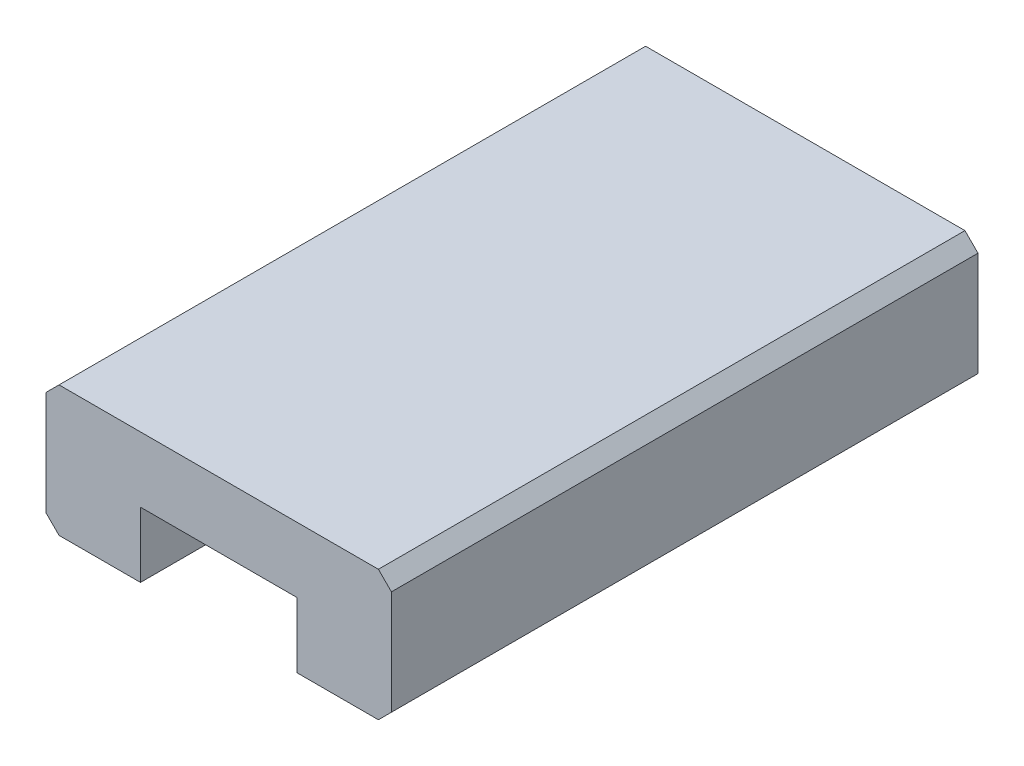
ISO-10303-21;
HEADER;
FILE_DESCRIPTION(('STEP AP214'),'2;1');
FILE_NAME('part.step','',(''),(''),'','','');
FILE_SCHEMA(('AUTOMOTIVE_DESIGN { 1 0 10303 214 1 1 1 1 }'));
ENDSEC;
DATA;
#1=APPLICATION_CONTEXT('core data for automotive mechanical design processes');
#2=APPLICATION_PROTOCOL_DEFINITION('international standard','automotive_design',2000,#1);
#3=PRODUCT_CONTEXT('',#1,'mechanical');
#4=PRODUCT('Part','Part','',(#3));
#5=PRODUCT_RELATED_PRODUCT_CATEGORY('part','',(#4));
#6=PRODUCT_DEFINITION_FORMATION('','',#4);
#7=PRODUCT_DEFINITION_CONTEXT('part definition',#1,'design');
#8=PRODUCT_DEFINITION('design','',#6,#7);
#9=PRODUCT_DEFINITION_SHAPE('','',#8);
#10=(LENGTH_UNIT() NAMED_UNIT(*) SI_UNIT(.MILLI.,.METRE.));
#11=(NAMED_UNIT(*) PLANE_ANGLE_UNIT() SI_UNIT($,.RADIAN.));
#12=(NAMED_UNIT(*) SI_UNIT($,.STERADIAN.) SOLID_ANGLE_UNIT());
#13=UNCERTAINTY_MEASURE_WITH_UNIT(LENGTH_MEASURE(1.E-05),#10,'distance_accuracy_value','');
#14=(GEOMETRIC_REPRESENTATION_CONTEXT(3) GLOBAL_UNCERTAINTY_ASSIGNED_CONTEXT((#13)) GLOBAL_UNIT_ASSIGNED_CONTEXT((#10,
#11,#12)) REPRESENTATION_CONTEXT('',''));
#15=CARTESIAN_POINT('',(0.,0.,0.));
#16=DIRECTION('',(0.,0.,1.));
#17=DIRECTION('',(1.,0.,0.));
#18=AXIS2_PLACEMENT_3D('',#15,#16,#17);
#19=CARTESIAN_POINT('',(0.,-5.,-45.));
#20=DIRECTION('',(0.,1.,0.));
#21=DIRECTION('',(-1.,0.,0.));
#22=AXIS2_PLACEMENT_3D('',#19,#20,#21);
#23=PLANE('',#22);
#24=DIRECTION('',(-1.,0.,0.));
#25=VECTOR('',#24,1.);
#26=CARTESIAN_POINT('',(0.,-5.,0.));
#27=LINE('',#26,#25);
#28=CARTESIAN_POINT('',(-6.,-5.,0.));
#29=VERTEX_POINT('',#28);
#30=CARTESIAN_POINT('',(-12.25,-5.,0.));
#31=VERTEX_POINT('',#30);
#32=EDGE_CURVE('E177',#29,#31,#27,.T.);
#33=ORIENTED_EDGE('',*,*,#32,.T.);
#34=DIRECTION('',(0.,0.,-1.));
#35=VECTOR('',#34,1.);
#36=CARTESIAN_POINT('',(-12.25,-5.,-45.));
#37=LINE('',#36,#35);
#38=CARTESIAN_POINT('',(-12.25,-5.,-45.));
#39=VERTEX_POINT('',#38);
#40=EDGE_CURVE('E51',#31,#39,#37,.T.);
#41=ORIENTED_EDGE('',*,*,#40,.T.);
#42=DIRECTION('',(-1.,0.,0.));
#43=VECTOR('',#42,1.);
#44=CARTESIAN_POINT('',(0.,-5.,-45.));
#45=LINE('',#44,#43);
#46=CARTESIAN_POINT('',(-6.,-5.,-45.));
#47=VERTEX_POINT('',#46);
#48=EDGE_CURVE('E148',#47,#39,#45,.T.);
#49=ORIENTED_EDGE('',*,*,#48,.F.);
#50=DIRECTION('',(0.,0.,1.));
#51=VECTOR('',#50,1.);
#52=CARTESIAN_POINT('',(-6.,-5.,-45.));
#53=LINE('',#52,#51);
#54=EDGE_CURVE('E133',#47,#29,#53,.T.);
#55=ORIENTED_EDGE('',*,*,#54,.T.);
#56=EDGE_LOOP('',(#33,#41,#49,#55));
#57=FACE_BOUND('',#56,.T.);
#58=ADVANCED_FACE('F41',(#57),#23,.F.);
#59=CARTESIAN_POINT('',(-13.25,0.,-45.));
#60=DIRECTION('',(1.,0.,0.));
#61=DIRECTION('',(0.,0.,-1.));
#62=AXIS2_PLACEMENT_3D('',#59,#60,#61);
#63=PLANE('',#62);
#64=DIRECTION('',(0.,1.,0.));
#65=VECTOR('',#64,1.);
#66=CARTESIAN_POINT('',(-13.25,0.,0.));
#67=LINE('',#66,#65);
#68=CARTESIAN_POINT('',(-13.25,-4.,0.));
#69=VERTEX_POINT('',#68);
#70=CARTESIAN_POINT('',(-13.25,3.99999999999999,0.));
#71=VERTEX_POINT('',#70);
#72=EDGE_CURVE('E152',#69,#71,#67,.T.);
#73=ORIENTED_EDGE('',*,*,#72,.T.);
#74=DIRECTION('',(0.,0.,-1.));
#75=VECTOR('',#74,1.);
#76=CARTESIAN_POINT('',(-13.25,3.99999999999999,-45.));
#77=LINE('',#76,#75);
#78=CARTESIAN_POINT('',(-13.25,3.99999999999999,-45.));
#79=VERTEX_POINT('',#78);
#80=EDGE_CURVE('E234',#71,#79,#77,.T.);
#81=ORIENTED_EDGE('',*,*,#80,.T.);
#82=DIRECTION('',(0.,1.,0.));
#83=VECTOR('',#82,1.);
#84=CARTESIAN_POINT('',(-13.25,0.,-45.));
#85=LINE('',#84,#83);
#86=CARTESIAN_POINT('',(-13.25,-4.,-45.));
#87=VERTEX_POINT('',#86);
#88=EDGE_CURVE('E145',#87,#79,#85,.T.);
#89=ORIENTED_EDGE('',*,*,#88,.F.);
#90=DIRECTION('',(0.,0.,1.));
#91=VECTOR('',#90,1.);
#92=CARTESIAN_POINT('',(-13.25,-4.,-45.));
#93=LINE('',#92,#91);
#94=EDGE_CURVE('E230',#87,#69,#93,.T.);
#95=ORIENTED_EDGE('',*,*,#94,.T.);
#96=EDGE_LOOP('',(#73,#81,#89,#95));
#97=FACE_BOUND('',#96,.T.);
#98=ADVANCED_FACE('F277',(#97),#63,.F.);
#99=CARTESIAN_POINT('',(0.,5.,-45.));
#100=DIRECTION('',(0.,1.,0.));
#101=DIRECTION('',(-1.,0.,0.));
#102=AXIS2_PLACEMENT_3D('',#99,#100,#101);
#103=PLANE('',#102);
#104=DIRECTION('',(-1.,0.,0.));
#105=VECTOR('',#104,1.);
#106=CARTESIAN_POINT('',(0.,5.,-45.));
#107=LINE('',#106,#105);
#108=CARTESIAN_POINT('',(12.25,5.,-45.));
#109=VERTEX_POINT('',#108);
#110=CARTESIAN_POINT('',(-12.25,5.,-45.));
#111=VERTEX_POINT('',#110);
#112=EDGE_CURVE('E171',#109,#111,#107,.T.);
#113=ORIENTED_EDGE('',*,*,#112,.T.);
#114=DIRECTION('',(0.,0.,1.));
#115=VECTOR('',#114,1.);
#116=CARTESIAN_POINT('',(-12.25,5.,0.));
#117=LINE('',#116,#115);
#118=CARTESIAN_POINT('',(-12.25,5.,0.));
#119=VERTEX_POINT('',#118);
#120=EDGE_CURVE('E214',#111,#119,#117,.T.);
#121=ORIENTED_EDGE('',*,*,#120,.T.);
#122=DIRECTION('',(-1.,0.,0.));
#123=VECTOR('',#122,1.);
#124=CARTESIAN_POINT('',(0.,5.,0.));
#125=LINE('',#124,#123);
#126=CARTESIAN_POINT('',(12.25,5.,0.));
#127=VERTEX_POINT('',#126);
#128=EDGE_CURVE('E194',#127,#119,#125,.T.);
#129=ORIENTED_EDGE('',*,*,#128,.F.);
#130=DIRECTION('',(0.,0.,-1.));
#131=VECTOR('',#130,1.);
#132=CARTESIAN_POINT('',(12.25,5.,-45.));
#133=LINE('',#132,#131);
#134=EDGE_CURVE('E205',#127,#109,#133,.T.);
#135=ORIENTED_EDGE('',*,*,#134,.T.);
#136=EDGE_LOOP('',(#113,#121,#129,#135));
#137=FACE_BOUND('',#136,.T.);
#138=ADVANCED_FACE('F283',(#137),#103,.T.);
#139=CARTESIAN_POINT('',(13.25,0.,-45.));
#140=DIRECTION('',(1.,0.,0.));
#141=DIRECTION('',(0.,0.,-1.));
#142=AXIS2_PLACEMENT_3D('',#139,#140,#141);
#143=PLANE('',#142);
#144=DIRECTION('',(0.,1.,0.));
#145=VECTOR('',#144,1.);
#146=CARTESIAN_POINT('',(13.25,0.,-45.));
#147=LINE('',#146,#145);
#148=CARTESIAN_POINT('',(13.25,-3.99999999999998,-45.));
#149=VERTEX_POINT('',#148);
#150=CARTESIAN_POINT('',(13.25,4.,-45.));
#151=VERTEX_POINT('',#150);
#152=EDGE_CURVE('E168',#149,#151,#147,.T.);
#153=ORIENTED_EDGE('',*,*,#152,.T.);
#154=DIRECTION('',(0.,0.,1.));
#155=VECTOR('',#154,1.);
#156=CARTESIAN_POINT('',(13.25,4.,-45.));
#157=LINE('',#156,#155);
#158=CARTESIAN_POINT('',(13.25,4.,0.));
#159=VERTEX_POINT('',#158);
#160=EDGE_CURVE('E250',#151,#159,#157,.T.);
#161=ORIENTED_EDGE('',*,*,#160,.T.);
#162=DIRECTION('',(0.,1.,0.));
#163=VECTOR('',#162,1.);
#164=CARTESIAN_POINT('',(13.25,0.,0.));
#165=LINE('',#164,#163);
#166=CARTESIAN_POINT('',(13.25,-3.99999999999998,0.));
#167=VERTEX_POINT('',#166);
#168=EDGE_CURVE('E190',#167,#159,#165,.T.);
#169=ORIENTED_EDGE('',*,*,#168,.F.);
#170=DIRECTION('',(0.,0.,-1.));
#171=VECTOR('',#170,1.);
#172=CARTESIAN_POINT('',(13.25,-3.99999999999998,-45.));
#173=LINE('',#172,#171);
#174=EDGE_CURVE('E247',#167,#149,#173,.T.);
#175=ORIENTED_EDGE('',*,*,#174,.T.);
#176=EDGE_LOOP('',(#153,#161,#169,#175));
#177=FACE_BOUND('',#176,.T.);
#178=ADVANCED_FACE('F291',(#177),#143,.T.);
#179=CARTESIAN_POINT('',(12.25,-5.,-45.));
#180=VERTEX_POINT('',#179);
#181=CARTESIAN_POINT('',(6.,-5.,-45.));
#182=VERTEX_POINT('',#181);
#183=EDGE_CURVE('E154',#180,#182,#45,.T.);
#184=ORIENTED_EDGE('',*,*,#183,.F.);
#185=DIRECTION('',(0.,0.,1.));
#186=VECTOR('',#185,1.);
#187=CARTESIAN_POINT('',(12.25,-5.,0.));
#188=LINE('',#187,#186);
#189=CARTESIAN_POINT('',(12.25,-5.,0.));
#190=VERTEX_POINT('',#189);
#191=EDGE_CURVE('E11',#180,#190,#188,.T.);
#192=ORIENTED_EDGE('',*,*,#191,.T.);
#193=CARTESIAN_POINT('',(6.,-5.,0.));
#194=VERTEX_POINT('',#193);
#195=EDGE_CURVE('E180',#190,#194,#27,.T.);
#196=ORIENTED_EDGE('',*,*,#195,.T.);
#197=DIRECTION('',(0.,0.,1.));
#198=VECTOR('',#197,1.);
#199=CARTESIAN_POINT('',(6.,-5.,-45.));
#200=LINE('',#199,#198);
#201=EDGE_CURVE('E201',#182,#194,#200,.T.);
#202=ORIENTED_EDGE('',*,*,#201,.F.);
#203=EDGE_LOOP('',(#184,#192,#196,#202));
#204=FACE_BOUND('',#203,.T.);
#205=ADVANCED_FACE('F260',(#204),#23,.F.);
#206=CARTESIAN_POINT('',(6.,0.,-45.));
#207=DIRECTION('',(1.,0.,0.));
#208=DIRECTION('',(0.,0.,-1.));
#209=AXIS2_PLACEMENT_3D('',#206,#207,#208);
#210=PLANE('',#209);
#211=DIRECTION('',(0.,1.,0.));
#212=VECTOR('',#211,1.);
#213=CARTESIAN_POINT('',(6.,0.,0.));
#214=LINE('',#213,#212);
#215=CARTESIAN_POINT('',(6.,0.,0.));
#216=VERTEX_POINT('',#215);
#217=EDGE_CURVE('E187',#194,#216,#214,.T.);
#218=ORIENTED_EDGE('',*,*,#217,.T.);
#219=DIRECTION('',(0.,0.,1.));
#220=VECTOR('',#219,1.);
#221=CARTESIAN_POINT('',(6.,0.,-45.));
#222=LINE('',#221,#220);
#223=CARTESIAN_POINT('',(6.,0.,-45.));
#224=VERTEX_POINT('',#223);
#225=EDGE_CURVE('E206',#224,#216,#222,.T.);
#226=ORIENTED_EDGE('',*,*,#225,.F.);
#227=DIRECTION('',(0.,1.,0.));
#228=VECTOR('',#227,1.);
#229=CARTESIAN_POINT('',(6.,0.,-45.));
#230=LINE('',#229,#228);
#231=EDGE_CURVE('E163',#182,#224,#230,.T.);
#232=ORIENTED_EDGE('',*,*,#231,.F.);
#233=ORIENTED_EDGE('',*,*,#201,.T.);
#234=EDGE_LOOP('',(#218,#226,#232,#233));
#235=FACE_BOUND('',#234,.T.);
#236=ADVANCED_FACE('F264',(#235),#210,.F.);
#237=CARTESIAN_POINT('',(0.,0.,-45.));
#238=DIRECTION('',(0.,1.,0.));
#239=DIRECTION('',(-1.,0.,0.));
#240=AXIS2_PLACEMENT_3D('',#237,#238,#239);
#241=PLANE('',#240);
#242=DIRECTION('',(-1.,0.,0.));
#243=VECTOR('',#242,1.);
#244=CARTESIAN_POINT('',(0.,0.,0.));
#245=LINE('',#244,#243);
#246=CARTESIAN_POINT('',(-6.,0.,0.));
#247=VERTEX_POINT('',#246);
#248=EDGE_CURVE('E183',#216,#247,#245,.T.);
#249=ORIENTED_EDGE('',*,*,#248,.T.);
#250=DIRECTION('',(0.,0.,1.));
#251=VECTOR('',#250,1.);
#252=CARTESIAN_POINT('',(-6.,0.,-45.));
#253=LINE('',#252,#251);
#254=CARTESIAN_POINT('',(-6.,0.,-45.));
#255=VERTEX_POINT('',#254);
#256=EDGE_CURVE('E144',#255,#247,#253,.T.);
#257=ORIENTED_EDGE('',*,*,#256,.F.);
#258=DIRECTION('',(-1.,0.,0.));
#259=VECTOR('',#258,1.);
#260=CARTESIAN_POINT('',(0.,0.,-45.));
#261=LINE('',#260,#259);
#262=EDGE_CURVE('E158',#224,#255,#261,.T.);
#263=ORIENTED_EDGE('',*,*,#262,.F.);
#264=ORIENTED_EDGE('',*,*,#225,.T.);
#265=EDGE_LOOP('',(#249,#257,#263,#264));
#266=FACE_BOUND('',#265,.T.);
#267=ADVANCED_FACE('F267',(#266),#241,.F.);
#268=CARTESIAN_POINT('',(-6.,0.,-45.));
#269=DIRECTION('',(1.,0.,0.));
#270=DIRECTION('',(0.,0.,-1.));
#271=AXIS2_PLACEMENT_3D('',#268,#269,#270);
#272=PLANE('',#271);
#273=DIRECTION('',(0.,1.,0.));
#274=VECTOR('',#273,1.);
#275=CARTESIAN_POINT('',(-6.,0.,0.));
#276=LINE('',#275,#274);
#277=EDGE_CURVE('E139',#29,#247,#276,.T.);
#278=ORIENTED_EDGE('',*,*,#277,.F.);
#279=ORIENTED_EDGE('',*,*,#54,.F.);
#280=DIRECTION('',(0.,1.,0.));
#281=VECTOR('',#280,1.);
#282=CARTESIAN_POINT('',(-6.,0.,-45.));
#283=LINE('',#282,#281);
#284=EDGE_CURVE('E137',#47,#255,#283,.T.);
#285=ORIENTED_EDGE('',*,*,#284,.T.);
#286=ORIENTED_EDGE('',*,*,#256,.T.);
#287=EDGE_LOOP('',(#278,#279,#285,#286));
#288=FACE_BOUND('',#287,.T.);
#289=ADVANCED_FACE('F135',(#288),#272,.T.);
#290=CARTESIAN_POINT('',(0.,0.,-45.));
#291=DIRECTION('',(0.,0.,1.));
#292=DIRECTION('',(1.,0.,0.));
#293=AXIS2_PLACEMENT_3D('',#290,#291,#292);
#294=PLANE('',#293);
#295=ORIENTED_EDGE('',*,*,#88,.T.);
#296=DIRECTION('',(0.707106781186542,0.707106781186553,0.));
#297=VECTOR('',#296,1.);
#298=CARTESIAN_POINT('',(-12.25,5.,-45.));
#299=LINE('',#298,#297);
#300=EDGE_CURVE('E244',#79,#111,#299,.T.);
#301=ORIENTED_EDGE('',*,*,#300,.T.);
#302=ORIENTED_EDGE('',*,*,#112,.F.);
#303=DIRECTION('',(-0.70710678118655,0.707106781186545,0.));
#304=VECTOR('',#303,1.);
#305=CARTESIAN_POINT('',(13.25,4.,-45.));
#306=LINE('',#305,#304);
#307=EDGE_CURVE('E64',#109,#151,#306,.F.);
#308=ORIENTED_EDGE('',*,*,#307,.T.);
#309=ORIENTED_EDGE('',*,*,#152,.F.);
#310=DIRECTION('',(-0.707106781186545,-0.70710678118655,0.));
#311=VECTOR('',#310,1.);
#312=CARTESIAN_POINT('',(12.25,-5.,-45.));
#313=LINE('',#312,#311);
#314=EDGE_CURVE('E58',#149,#180,#313,.T.);
#315=ORIENTED_EDGE('',*,*,#314,.T.);
#316=ORIENTED_EDGE('',*,*,#183,.T.);
#317=ORIENTED_EDGE('',*,*,#231,.T.);
#318=ORIENTED_EDGE('',*,*,#262,.T.);
#319=ORIENTED_EDGE('',*,*,#284,.F.);
#320=ORIENTED_EDGE('',*,*,#48,.T.);
#321=DIRECTION('',(0.70710678118655,-0.707106781186545,0.));
#322=VECTOR('',#321,1.);
#323=CARTESIAN_POINT('',(-13.25,-4.,-45.));
#324=LINE('',#323,#322);
#325=EDGE_CURVE('E239',#39,#87,#324,.F.);
#326=ORIENTED_EDGE('',*,*,#325,.T.);
#327=EDGE_LOOP('',(#295,#301,#302,#308,#309,#315,#316,#317,#318,#319,#320,#326));
#328=FACE_BOUND('',#327,.T.);
#329=ADVANCED_FACE('F156',(#328),#294,.F.);
#330=CARTESIAN_POINT('',(0.,0.,0.));
#331=DIRECTION('',(0.,0.,1.));
#332=DIRECTION('',(1.,0.,0.));
#333=AXIS2_PLACEMENT_3D('',#330,#331,#332);
#334=PLANE('',#333);
#335=ORIENTED_EDGE('',*,*,#128,.T.);
#336=DIRECTION('',(-0.707106781186542,-0.707106781186553,0.));
#337=VECTOR('',#336,1.);
#338=CARTESIAN_POINT('',(-8.62500000000009,8.62499999999996,0.));
#339=LINE('',#338,#337);
#340=EDGE_CURVE('E227',#119,#71,#339,.T.);
#341=ORIENTED_EDGE('',*,*,#340,.T.);
#342=ORIENTED_EDGE('',*,*,#72,.F.);
#343=DIRECTION('',(-0.70710678118655,0.707106781186545,0.));
#344=VECTOR('',#343,1.);
#345=CARTESIAN_POINT('',(-8.62499999999996,-8.62500000000001,0.));
#346=LINE('',#345,#344);
#347=EDGE_CURVE('E221',#69,#31,#346,.F.);
#348=ORIENTED_EDGE('',*,*,#347,.T.);
#349=ORIENTED_EDGE('',*,*,#32,.F.);
#350=ORIENTED_EDGE('',*,*,#277,.T.);
#351=ORIENTED_EDGE('',*,*,#248,.F.);
#352=ORIENTED_EDGE('',*,*,#217,.F.);
#353=ORIENTED_EDGE('',*,*,#195,.F.);
#354=DIRECTION('',(0.707106781186545,0.70710678118655,0.));
#355=VECTOR('',#354,1.);
#356=CARTESIAN_POINT('',(8.62500000000004,-8.62499999999998,0.));
#357=LINE('',#356,#355);
#358=EDGE_CURVE('E218',#190,#167,#357,.T.);
#359=ORIENTED_EDGE('',*,*,#358,.T.);
#360=ORIENTED_EDGE('',*,*,#168,.T.);
#361=DIRECTION('',(0.70710678118655,-0.707106781186545,0.));
#362=VECTOR('',#361,1.);
#363=CARTESIAN_POINT('',(8.62499999999996,8.62500000000001,0.));
#364=LINE('',#363,#362);
#365=EDGE_CURVE('E224',#159,#127,#364,.F.);
#366=ORIENTED_EDGE('',*,*,#365,.T.);
#367=EDGE_LOOP('',(#335,#341,#342,#348,#349,#350,#351,#352,#353,#359,#360,#366));
#368=FACE_BOUND('',#367,.T.);
#369=ADVANCED_FACE('F269',(#368),#334,.T.);
#370=CARTESIAN_POINT('',(-12.25,5.,-45.));
#371=DIRECTION('',(-0.707106781186553,0.707106781186542,0.));
#372=DIRECTION('',(0.,0.,-1.));
#373=AXIS2_PLACEMENT_3D('',#370,#371,#372);
#374=PLANE('',#373);
#375=ORIENTED_EDGE('',*,*,#300,.F.);
#376=ORIENTED_EDGE('',*,*,#80,.F.);
#377=ORIENTED_EDGE('',*,*,#340,.F.);
#378=ORIENTED_EDGE('',*,*,#120,.F.);
#379=EDGE_LOOP('',(#375,#376,#377,#378));
#380=FACE_BOUND('',#379,.T.);
#381=ADVANCED_FACE('F280',(#380),#374,.T.);
#382=CARTESIAN_POINT('',(13.25,4.,-45.));
#383=DIRECTION('',(-0.707106781186545,-0.70710678118655,0.));
#384=DIRECTION('',(0.,0.,1.));
#385=AXIS2_PLACEMENT_3D('',#382,#383,#384);
#386=PLANE('',#385);
#387=ORIENTED_EDGE('',*,*,#307,.F.);
#388=ORIENTED_EDGE('',*,*,#134,.F.);
#389=ORIENTED_EDGE('',*,*,#365,.F.);
#390=ORIENTED_EDGE('',*,*,#160,.F.);
#391=EDGE_LOOP('',(#387,#388,#389,#390));
#392=FACE_BOUND('',#391,.T.);
#393=ADVANCED_FACE('F287',(#392),#386,.F.);
#394=CARTESIAN_POINT('',(-13.25,-4.,-45.));
#395=DIRECTION('',(0.707106781186545,0.70710678118655,0.));
#396=DIRECTION('',(0.,0.,1.));
#397=AXIS2_PLACEMENT_3D('',#394,#395,#396);
#398=PLANE('',#397);
#399=ORIENTED_EDGE('',*,*,#325,.F.);
#400=ORIENTED_EDGE('',*,*,#40,.F.);
#401=ORIENTED_EDGE('',*,*,#347,.F.);
#402=ORIENTED_EDGE('',*,*,#94,.F.);
#403=EDGE_LOOP('',(#399,#400,#401,#402));
#404=FACE_BOUND('',#403,.T.);
#405=ADVANCED_FACE('F272',(#404),#398,.F.);
#406=CARTESIAN_POINT('',(12.25,-5.,-45.));
#407=DIRECTION('',(0.70710678118655,-0.707106781186545,0.));
#408=DIRECTION('',(0.,0.,-1.));
#409=AXIS2_PLACEMENT_3D('',#406,#407,#408);
#410=PLANE('',#409);
#411=ORIENTED_EDGE('',*,*,#314,.F.);
#412=ORIENTED_EDGE('',*,*,#174,.F.);
#413=ORIENTED_EDGE('',*,*,#358,.F.);
#414=ORIENTED_EDGE('',*,*,#191,.F.);
#415=EDGE_LOOP('',(#411,#412,#413,#414));
#416=FACE_BOUND('',#415,.T.);
#417=ADVANCED_FACE('F44',(#416),#410,.T.);
#418=CLOSED_SHELL('',(#58,#98,#138,#178,#205,#236,#267,#289,#329,#369,#381,#393,#405,#417));
#419=MANIFOLD_SOLID_BREP('B2',#418);
#420=ADVANCED_BREP_SHAPE_REPRESENTATION('',(#18,#419),#14);
#421=SHAPE_DEFINITION_REPRESENTATION(#9,#420);
ENDSEC;
END-ISO-10303-21;
